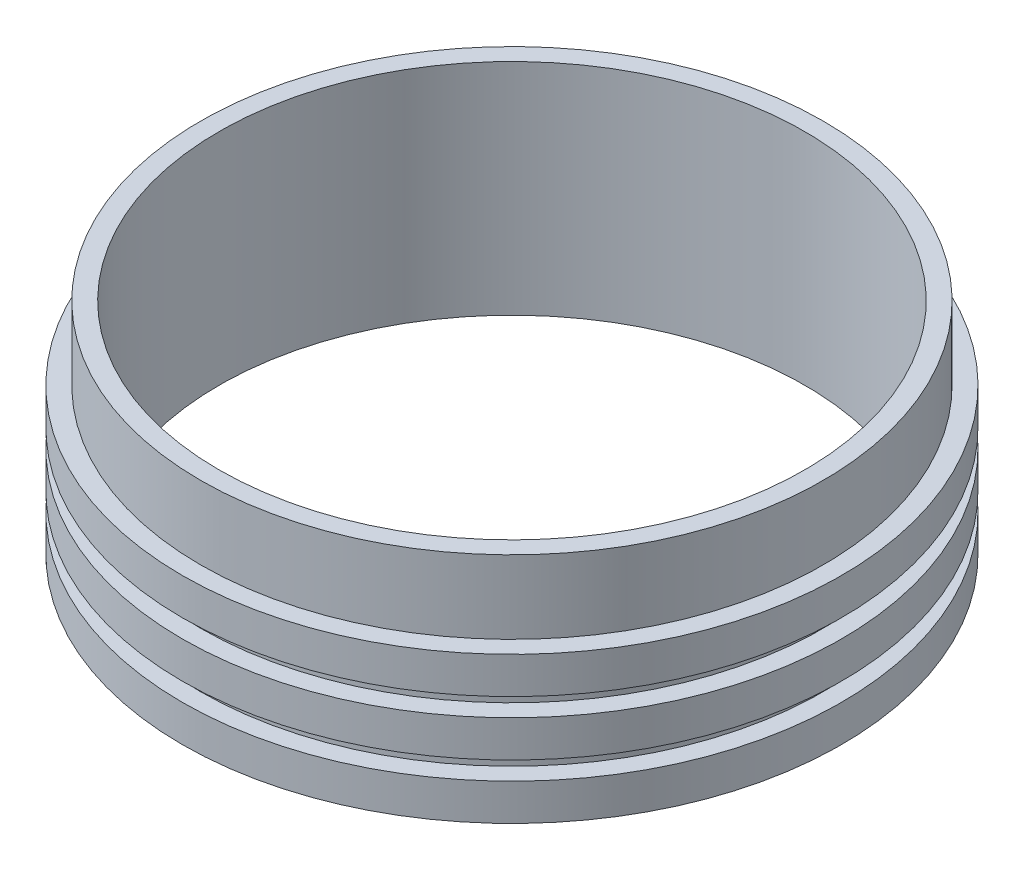
ISO-10303-21;
HEADER;
FILE_DESCRIPTION(('STEP AP214'),'2;1');
FILE_NAME('part.step','',(''),(''),'','','');
FILE_SCHEMA(('AUTOMOTIVE_DESIGN { 1 0 10303 214 1 1 1 1 }'));
ENDSEC;
DATA;
#1=APPLICATION_CONTEXT('core data for automotive mechanical design processes');
#2=APPLICATION_PROTOCOL_DEFINITION('international standard','automotive_design',2000,#1);
#3=PRODUCT_CONTEXT('',#1,'mechanical');
#4=PRODUCT('Part','Part','',(#3));
#5=PRODUCT_RELATED_PRODUCT_CATEGORY('part','',(#4));
#6=PRODUCT_DEFINITION_FORMATION('','',#4);
#7=PRODUCT_DEFINITION_CONTEXT('part definition',#1,'design');
#8=PRODUCT_DEFINITION('design','',#6,#7);
#9=PRODUCT_DEFINITION_SHAPE('','',#8);
#10=(LENGTH_UNIT() NAMED_UNIT(*) SI_UNIT(.MILLI.,.METRE.));
#11=(NAMED_UNIT(*) PLANE_ANGLE_UNIT() SI_UNIT($,.RADIAN.));
#12=(NAMED_UNIT(*) SI_UNIT($,.STERADIAN.) SOLID_ANGLE_UNIT());
#13=UNCERTAINTY_MEASURE_WITH_UNIT(LENGTH_MEASURE(1.E-05),#10,'distance_accuracy_value','');
#14=(GEOMETRIC_REPRESENTATION_CONTEXT(3) GLOBAL_UNCERTAINTY_ASSIGNED_CONTEXT((#13)) GLOBAL_UNIT_ASSIGNED_CONTEXT((#10,
#11,#12)) REPRESENTATION_CONTEXT('',''));
#15=CARTESIAN_POINT('',(0.,0.,0.));
#16=DIRECTION('',(0.,0.,1.));
#17=DIRECTION('',(1.,0.,0.));
#18=AXIS2_PLACEMENT_3D('',#15,#16,#17);
#19=CARTESIAN_POINT('',(0.,4.5,0.));
#20=DIRECTION('',(0.,-1.,0.));
#21=DIRECTION('',(0.,0.,-1.));
#22=AXIS2_PLACEMENT_3D('',#19,#20,#21);
#23=CYLINDRICAL_SURFACE('',#22,9.);
#24=CARTESIAN_POINT('',(0.,1.5,0.));
#25=DIRECTION('',(0.,1.,0.));
#26=DIRECTION('',(0.,0.,1.));
#27=AXIS2_PLACEMENT_3D('',#24,#25,#26);
#28=CIRCLE('',#27,9.);
#29=CARTESIAN_POINT('',(0.,1.5,9.));
#30=VERTEX_POINT('',#29);
#31=EDGE_CURVE('E11',#30,#30,#28,.T.);
#32=ORIENTED_EDGE('',*,*,#31,.T.);
#33=EDGE_LOOP('',(#32));
#34=FACE_BOUND('',#33,.T.);
#35=CARTESIAN_POINT('',(0.,2.5,0.));
#36=DIRECTION('',(0.,-1.,0.));
#37=DIRECTION('',(0.,0.,-1.));
#38=AXIS2_PLACEMENT_3D('',#35,#36,#37);
#39=CIRCLE('',#38,9.);
#40=CARTESIAN_POINT('',(0.,2.5,9.));
#41=VERTEX_POINT('',#40);
#42=EDGE_CURVE('E104',#41,#41,#39,.T.);
#43=ORIENTED_EDGE('',*,*,#42,.T.);
#44=EDGE_LOOP('',(#43));
#45=FACE_BOUND('',#44,.T.);
#46=ADVANCED_FACE('F36',(#34,#45),#23,.T.);
#47=CARTESIAN_POINT('',(0.,3.,0.));
#48=DIRECTION('',(0.,1.,0.));
#49=DIRECTION('',(0.,0.,1.));
#50=AXIS2_PLACEMENT_3D('',#47,#48,#49);
#51=CIRCLE('',#50,9.);
#52=CARTESIAN_POINT('',(0.,3.,9.));
#53=VERTEX_POINT('',#52);
#54=EDGE_CURVE('E101',#53,#53,#51,.T.);
#55=ORIENTED_EDGE('',*,*,#54,.T.);
#56=EDGE_LOOP('',(#55));
#57=FACE_BOUND('',#56,.T.);
#58=CARTESIAN_POINT('',(0.,4.,0.));
#59=DIRECTION('',(0.,-1.,0.));
#60=DIRECTION('',(0.,0.,-1.));
#61=AXIS2_PLACEMENT_3D('',#58,#59,#60);
#62=CIRCLE('',#61,9.);
#63=CARTESIAN_POINT('',(0.,4.,9.));
#64=VERTEX_POINT('',#63);
#65=EDGE_CURVE('E107',#64,#64,#62,.T.);
#66=ORIENTED_EDGE('',*,*,#65,.T.);
#67=EDGE_LOOP('',(#66));
#68=FACE_BOUND('',#67,.T.);
#69=ADVANCED_FACE('F156',(#57,#68),#23,.T.);
#70=CARTESIAN_POINT('',(0.,4.,9.5));
#71=DIRECTION('',(0.,-1.,0.));
#72=DIRECTION('',(0.,0.,-1.));
#73=AXIS2_PLACEMENT_3D('',#70,#71,#72);
#74=PLANE('',#73);
#75=ORIENTED_EDGE('',*,*,#65,.F.);
#76=EDGE_LOOP('',(#75));
#77=FACE_BOUND('',#76,.T.);
#78=CARTESIAN_POINT('',(0.,4.,0.));
#79=DIRECTION('',(0.,1.,0.));
#80=DIRECTION('',(0.,0.,1.));
#81=AXIS2_PLACEMENT_3D('',#78,#79,#80);
#82=CIRCLE('',#81,8.5);
#83=CARTESIAN_POINT('',(0.,4.,8.5));
#84=VERTEX_POINT('',#83);
#85=EDGE_CURVE('E92',#84,#84,#82,.T.);
#86=ORIENTED_EDGE('',*,*,#85,.F.);
#87=EDGE_LOOP('',(#86));
#88=FACE_BOUND('',#87,.T.);
#89=ADVANCED_FACE('F147',(#77,#88),#74,.F.);
#90=CARTESIAN_POINT('',(0.,4.5,0.));
#91=DIRECTION('',(0.,1.,0.));
#92=DIRECTION('',(0.,0.,1.));
#93=AXIS2_PLACEMENT_3D('',#90,#91,#92);
#94=CYLINDRICAL_SURFACE('',#93,8.5);
#95=DIRECTION('',(0.,1.,0.));
#96=VECTOR('',#95,1.);
#97=CARTESIAN_POINT('',(0.,4.5,8.5));
#98=LINE('',#97,#96);
#99=CARTESIAN_POINT('',(0.,4.5,8.5));
#100=VERTEX_POINT('',#99);
#101=EDGE_CURVE('E88',#84,#100,#98,.T.);
#102=ORIENTED_EDGE('',*,*,#101,.T.);
#103=ORIENTED_EDGE('',*,*,#101,.F.);
#104=ORIENTED_EDGE('',*,*,#85,.T.);
#105=EDGE_LOOP('',(#102,#103,#104));
#106=FACE_BOUND('',#105,.T.);
#107=CARTESIAN_POINT('',(0.,6.,0.));
#108=DIRECTION('',(0.,1.,0.));
#109=DIRECTION('',(0.,0.,1.));
#110=AXIS2_PLACEMENT_3D('',#107,#108,#109);
#111=CIRCLE('',#110,8.5);
#112=CARTESIAN_POINT('',(0.,6.,8.5));
#113=VERTEX_POINT('',#112);
#114=EDGE_CURVE('E139',#113,#113,#111,.T.);
#115=ORIENTED_EDGE('',*,*,#114,.F.);
#116=EDGE_LOOP('',(#115));
#117=FACE_BOUND('',#116,.T.);
#118=ADVANCED_FACE('F89',(#106,#117),#94,.T.);
#119=CARTESIAN_POINT('',(0.,3.,9.5));
#120=DIRECTION('',(0.,1.,0.));
#121=DIRECTION('',(0.,0.,1.));
#122=AXIS2_PLACEMENT_3D('',#119,#120,#121);
#123=PLANE('',#122);
#124=ORIENTED_EDGE('',*,*,#54,.F.);
#125=EDGE_LOOP('',(#124));
#126=FACE_BOUND('',#125,.T.);
#127=CARTESIAN_POINT('',(0.,3.,0.));
#128=DIRECTION('',(0.,1.,0.));
#129=DIRECTION('',(0.,0.,1.));
#130=AXIS2_PLACEMENT_3D('',#127,#128,#129);
#131=CIRCLE('',#130,8.5);
#132=CARTESIAN_POINT('',(0.,3.,8.5));
#133=VERTEX_POINT('',#132);
#134=EDGE_CURVE('E96',#133,#133,#131,.T.);
#135=ORIENTED_EDGE('',*,*,#134,.T.);
#136=EDGE_LOOP('',(#135));
#137=FACE_BOUND('',#136,.T.);
#138=ADVANCED_FACE('F146',(#126,#137),#123,.F.);
#139=CARTESIAN_POINT('',(0.,2.5,9.5));
#140=DIRECTION('',(0.,-1.,0.));
#141=DIRECTION('',(0.,0.,-1.));
#142=AXIS2_PLACEMENT_3D('',#139,#140,#141);
#143=PLANE('',#142);
#144=ORIENTED_EDGE('',*,*,#42,.F.);
#145=EDGE_LOOP('',(#144));
#146=FACE_BOUND('',#145,.T.);
#147=CARTESIAN_POINT('',(0.,2.5,0.));
#148=DIRECTION('',(0.,1.,0.));
#149=DIRECTION('',(0.,0.,1.));
#150=AXIS2_PLACEMENT_3D('',#147,#148,#149);
#151=CIRCLE('',#150,8.5);
#152=CARTESIAN_POINT('',(0.,2.5,8.5));
#153=VERTEX_POINT('',#152);
#154=EDGE_CURVE('E114',#153,#153,#151,.T.);
#155=ORIENTED_EDGE('',*,*,#154,.F.);
#156=EDGE_LOOP('',(#155));
#157=FACE_BOUND('',#156,.T.);
#158=ADVANCED_FACE('F153',(#146,#157),#143,.F.);
#159=CARTESIAN_POINT('',(0.,4.5,0.));
#160=DIRECTION('',(0.,1.,0.));
#161=DIRECTION('',(0.,0.,1.));
#162=AXIS2_PLACEMENT_3D('',#159,#160,#161);
#163=CYLINDRICAL_SURFACE('',#162,8.5);
#164=DIRECTION('',(0.,1.,0.));
#165=VECTOR('',#164,1.);
#166=CARTESIAN_POINT('',(0.,3.,8.5));
#167=LINE('',#166,#165);
#168=EDGE_CURVE('E115',#153,#133,#167,.T.);
#169=ORIENTED_EDGE('',*,*,#168,.T.);
#170=ORIENTED_EDGE('',*,*,#134,.F.);
#171=ORIENTED_EDGE('',*,*,#168,.F.);
#172=ORIENTED_EDGE('',*,*,#154,.T.);
#173=EDGE_LOOP('',(#169,#170,#171,#172));
#174=FACE_BOUND('',#173,.T.);
#175=ADVANCED_FACE('F187',(#174),#163,.T.);
#176=CARTESIAN_POINT('',(0.,1.5,9.5));
#177=DIRECTION('',(0.,1.,0.));
#178=DIRECTION('',(0.,0.,1.));
#179=AXIS2_PLACEMENT_3D('',#176,#177,#178);
#180=PLANE('',#179);
#181=ORIENTED_EDGE('',*,*,#31,.F.);
#182=EDGE_LOOP('',(#181));
#183=FACE_BOUND('',#182,.T.);
#184=CARTESIAN_POINT('',(0.,1.5,0.));
#185=DIRECTION('',(0.,1.,0.));
#186=DIRECTION('',(0.,0.,1.));
#187=AXIS2_PLACEMENT_3D('',#184,#185,#186);
#188=CIRCLE('',#187,8.5);
#189=CARTESIAN_POINT('',(0.,1.5,8.5));
#190=VERTEX_POINT('',#189);
#191=EDGE_CURVE('E123',#190,#190,#188,.T.);
#192=ORIENTED_EDGE('',*,*,#191,.T.);
#193=EDGE_LOOP('',(#192));
#194=FACE_BOUND('',#193,.T.);
#195=ADVANCED_FACE('F185',(#183,#194),#180,.F.);
#196=CARTESIAN_POINT('',(0.,1.,9.5));
#197=DIRECTION('',(0.,-1.,0.));
#198=DIRECTION('',(0.,0.,-1.));
#199=AXIS2_PLACEMENT_3D('',#196,#197,#198);
#200=PLANE('',#199);
#201=CARTESIAN_POINT('',(0.,1.,0.));
#202=DIRECTION('',(0.,-1.,0.));
#203=DIRECTION('',(0.,0.,-1.));
#204=AXIS2_PLACEMENT_3D('',#201,#202,#203);
#205=CIRCLE('',#204,9.);
#206=CARTESIAN_POINT('',(0.,1.,9.));
#207=VERTEX_POINT('',#206);
#208=EDGE_CURVE('E45',#207,#207,#205,.T.);
#209=ORIENTED_EDGE('',*,*,#208,.F.);
#210=EDGE_LOOP('',(#209));
#211=FACE_BOUND('',#210,.T.);
#212=CARTESIAN_POINT('',(0.,1.,0.));
#213=DIRECTION('',(0.,1.,0.));
#214=DIRECTION('',(0.,0.,1.));
#215=AXIS2_PLACEMENT_3D('',#212,#213,#214);
#216=CIRCLE('',#215,8.5);
#217=CARTESIAN_POINT('',(0.,1.,8.5));
#218=VERTEX_POINT('',#217);
#219=EDGE_CURVE('E125',#218,#218,#216,.T.);
#220=ORIENTED_EDGE('',*,*,#219,.F.);
#221=EDGE_LOOP('',(#220));
#222=FACE_BOUND('',#221,.T.);
#223=ADVANCED_FACE('F181',(#211,#222),#200,.F.);
#224=CARTESIAN_POINT('',(0.,4.5,0.));
#225=DIRECTION('',(0.,1.,0.));
#226=DIRECTION('',(0.,0.,1.));
#227=AXIS2_PLACEMENT_3D('',#224,#225,#226);
#228=CYLINDRICAL_SURFACE('',#227,8.5);
#229=DIRECTION('',(0.,1.,0.));
#230=VECTOR('',#229,1.);
#231=CARTESIAN_POINT('',(0.,1.5,8.5));
#232=LINE('',#231,#230);
#233=EDGE_CURVE('E126',#218,#190,#232,.T.);
#234=ORIENTED_EDGE('',*,*,#233,.T.);
#235=ORIENTED_EDGE('',*,*,#191,.F.);
#236=ORIENTED_EDGE('',*,*,#233,.F.);
#237=ORIENTED_EDGE('',*,*,#219,.T.);
#238=EDGE_LOOP('',(#234,#235,#236,#237));
#239=FACE_BOUND('',#238,.T.);
#240=ADVANCED_FACE('F176',(#239),#228,.T.);
#241=CARTESIAN_POINT('',(0.,0.,0.));
#242=DIRECTION('',(0.,1.,0.));
#243=DIRECTION('',(0.,0.,1.));
#244=AXIS2_PLACEMENT_3D('',#241,#242,#243);
#245=PLANE('',#244);
#246=CARTESIAN_POINT('',(0.,0.,0.));
#247=DIRECTION('',(0.,1.,0.));
#248=DIRECTION('',(0.,0.,1.));
#249=AXIS2_PLACEMENT_3D('',#246,#247,#248);
#250=CIRCLE('',#249,8.);
#251=CARTESIAN_POINT('',(0.,0.,8.));
#252=VERTEX_POINT('',#251);
#253=EDGE_CURVE('E133',#252,#252,#250,.T.);
#254=ORIENTED_EDGE('',*,*,#253,.T.);
#255=EDGE_LOOP('',(#254));
#256=FACE_BOUND('',#255,.T.);
#257=CARTESIAN_POINT('',(0.,0.,0.));
#258=DIRECTION('',(0.,1.,0.));
#259=DIRECTION('',(0.,0.,1.));
#260=AXIS2_PLACEMENT_3D('',#257,#258,#259);
#261=CIRCLE('',#260,9.);
#262=CARTESIAN_POINT('',(0.,0.,9.));
#263=VERTEX_POINT('',#262);
#264=EDGE_CURVE('E94',#263,#263,#261,.T.);
#265=ORIENTED_EDGE('',*,*,#264,.F.);
#266=EDGE_LOOP('',(#265));
#267=FACE_BOUND('',#266,.T.);
#268=ADVANCED_FACE('F168',(#256,#267),#245,.F.);
#269=ORIENTED_EDGE('',*,*,#208,.T.);
#270=EDGE_LOOP('',(#269));
#271=FACE_BOUND('',#270,.T.);
#272=ORIENTED_EDGE('',*,*,#264,.T.);
#273=EDGE_LOOP('',(#272));
#274=FACE_BOUND('',#273,.T.);
#275=ADVANCED_FACE('F38',(#271,#274),#23,.T.);
#276=CARTESIAN_POINT('',(0.,0.,0.));
#277=DIRECTION('',(0.,1.,0.));
#278=DIRECTION('',(0.,0.,1.));
#279=AXIS2_PLACEMENT_3D('',#276,#277,#278);
#280=CYLINDRICAL_SURFACE('',#279,8.);
#281=ORIENTED_EDGE('',*,*,#253,.F.);
#282=EDGE_LOOP('',(#281));
#283=FACE_BOUND('',#282,.T.);
#284=CARTESIAN_POINT('',(0.,6.,0.));
#285=DIRECTION('',(0.,1.,0.));
#286=DIRECTION('',(0.,0.,1.));
#287=AXIS2_PLACEMENT_3D('',#284,#285,#286);
#288=CIRCLE('',#287,8.);
#289=CARTESIAN_POINT('',(0.,6.,8.));
#290=VERTEX_POINT('',#289);
#291=EDGE_CURVE('E136',#290,#290,#288,.F.);
#292=ORIENTED_EDGE('',*,*,#291,.F.);
#293=EDGE_LOOP('',(#292));
#294=FACE_BOUND('',#293,.T.);
#295=ADVANCED_FACE('F167',(#283,#294),#280,.F.);
#296=CARTESIAN_POINT('',(0.,6.,0.));
#297=DIRECTION('',(0.,1.,0.));
#298=DIRECTION('',(0.,0.,1.));
#299=AXIS2_PLACEMENT_3D('',#296,#297,#298);
#300=PLANE('',#299);
#301=ORIENTED_EDGE('',*,*,#114,.T.);
#302=EDGE_LOOP('',(#301));
#303=FACE_BOUND('',#302,.T.);
#304=ORIENTED_EDGE('',*,*,#291,.T.);
#305=EDGE_LOOP('',(#304));
#306=FACE_BOUND('',#305,.T.);
#307=ADVANCED_FACE('F143',(#303,#306),#300,.T.);
#308=CLOSED_SHELL('',(#46,#69,#89,#118,#138,#158,#175,#195,#223,#240,#268,#275,#295,#307));
#309=MANIFOLD_SOLID_BREP('B2',#308);
#310=ADVANCED_BREP_SHAPE_REPRESENTATION('',(#18,#309),#14);
#311=SHAPE_DEFINITION_REPRESENTATION(#9,#310);
ENDSEC;
END-ISO-10303-21;
